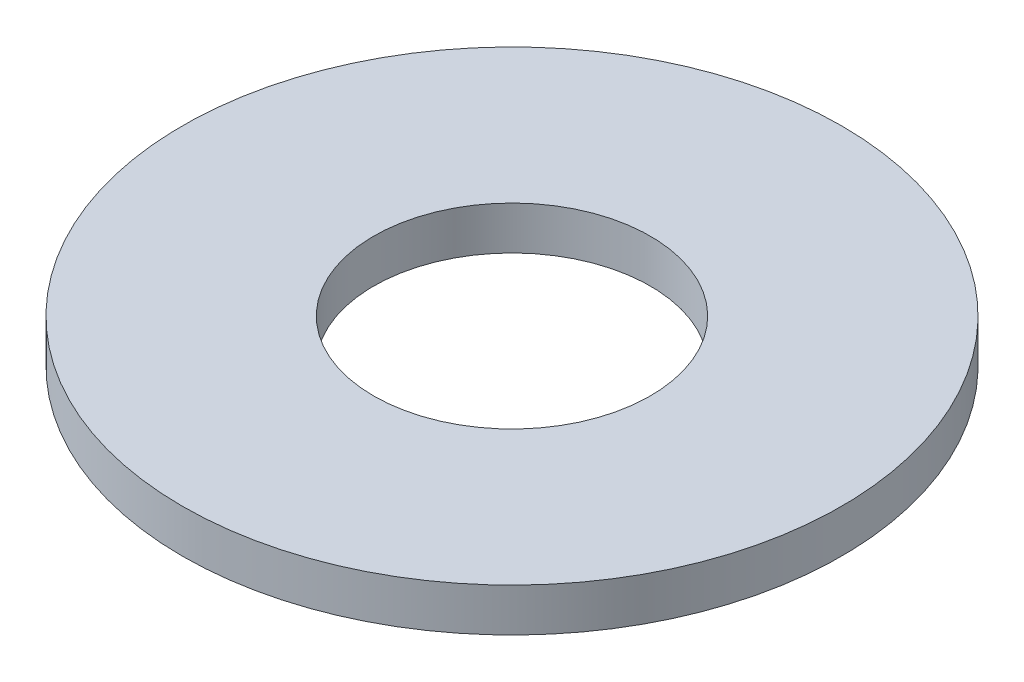
ISO-10303-21;
HEADER;
FILE_DESCRIPTION(('STEP AP214'),'2;1');
FILE_NAME('part.step','',(''),(''),'','','');
FILE_SCHEMA(('AUTOMOTIVE_DESIGN { 1 0 10303 214 1 1 1 1 }'));
ENDSEC;
DATA;
#1=APPLICATION_CONTEXT('core data for automotive mechanical design processes');
#2=APPLICATION_PROTOCOL_DEFINITION('international standard','automotive_design',2000,#1);
#3=PRODUCT_CONTEXT('',#1,'mechanical');
#4=PRODUCT('Part','Part','',(#3));
#5=PRODUCT_RELATED_PRODUCT_CATEGORY('part','',(#4));
#6=PRODUCT_DEFINITION_FORMATION('','',#4);
#7=PRODUCT_DEFINITION_CONTEXT('part definition',#1,'design');
#8=PRODUCT_DEFINITION('design','',#6,#7);
#9=PRODUCT_DEFINITION_SHAPE('','',#8);
#10=(LENGTH_UNIT() NAMED_UNIT(*) SI_UNIT(.MILLI.,.METRE.));
#11=(NAMED_UNIT(*) PLANE_ANGLE_UNIT() SI_UNIT($,.RADIAN.));
#12=(NAMED_UNIT(*) SI_UNIT($,.STERADIAN.) SOLID_ANGLE_UNIT());
#13=UNCERTAINTY_MEASURE_WITH_UNIT(LENGTH_MEASURE(1.E-05),#10,'distance_accuracy_value','');
#14=(GEOMETRIC_REPRESENTATION_CONTEXT(3) GLOBAL_UNCERTAINTY_ASSIGNED_CONTEXT((#13)) GLOBAL_UNIT_ASSIGNED_CONTEXT((#10,
#11,#12)) REPRESENTATION_CONTEXT('',''));
#15=CARTESIAN_POINT('',(0.,0.,0.));
#16=DIRECTION('',(0.,0.,1.));
#17=DIRECTION('',(1.,0.,0.));
#18=AXIS2_PLACEMENT_3D('',#15,#16,#17);
#19=CARTESIAN_POINT('',(0.,5.,0.));
#20=DIRECTION('',(0.,-1.,0.));
#21=DIRECTION('',(0.,0.,-1.));
#22=AXIS2_PLACEMENT_3D('',#19,#20,#21);
#23=CYLINDRICAL_SURFACE('',#22,38.1);
#24=CARTESIAN_POINT('',(0.,5.,0.));
#25=DIRECTION('',(0.,1.,0.));
#26=DIRECTION('',(0.,0.,1.));
#27=AXIS2_PLACEMENT_3D('',#24,#25,#26);
#28=CIRCLE('',#27,38.1);
#29=CARTESIAN_POINT('',(0.,5.,38.1));
#30=VERTEX_POINT('',#29);
#31=EDGE_CURVE('E10',#30,#30,#28,.T.);
#32=ORIENTED_EDGE('',*,*,#31,.F.);
#33=EDGE_LOOP('',(#32));
#34=FACE_BOUND('',#33,.T.);
#35=CARTESIAN_POINT('',(0.,0.,0.));
#36=DIRECTION('',(0.,1.,0.));
#37=DIRECTION('',(0.,0.,1.));
#38=AXIS2_PLACEMENT_3D('',#35,#36,#37);
#39=CIRCLE('',#38,38.1);
#40=CARTESIAN_POINT('',(0.,0.,38.1));
#41=VERTEX_POINT('',#40);
#42=EDGE_CURVE('E32',#41,#41,#39,.T.);
#43=ORIENTED_EDGE('',*,*,#42,.T.);
#44=EDGE_LOOP('',(#43));
#45=FACE_BOUND('',#44,.T.);
#46=ADVANCED_FACE('F29',(#34,#45),#23,.T.);
#47=CARTESIAN_POINT('',(0.,5.,0.));
#48=DIRECTION('',(0.,1.,0.));
#49=DIRECTION('',(0.,0.,1.));
#50=AXIS2_PLACEMENT_3D('',#47,#48,#49);
#51=PLANE('',#50);
#52=CARTESIAN_POINT('',(0.,5.,0.));
#53=DIRECTION('',(0.,1.,0.));
#54=DIRECTION('',(0.,0.,1.));
#55=AXIS2_PLACEMENT_3D('',#52,#53,#54);
#56=CIRCLE('',#55,16.);
#57=CARTESIAN_POINT('',(0.,5.,16.));
#58=VERTEX_POINT('',#57);
#59=EDGE_CURVE('E41',#58,#58,#56,.T.);
#60=ORIENTED_EDGE('',*,*,#59,.F.);
#61=EDGE_LOOP('',(#60));
#62=FACE_BOUND('',#61,.T.);
#63=ORIENTED_EDGE('',*,*,#31,.T.);
#64=EDGE_LOOP('',(#63));
#65=FACE_BOUND('',#64,.T.);
#66=ADVANCED_FACE('F56',(#62,#65),#51,.T.);
#67=CARTESIAN_POINT('',(0.,0.,0.));
#68=DIRECTION('',(0.,1.,0.));
#69=DIRECTION('',(0.,0.,1.));
#70=AXIS2_PLACEMENT_3D('',#67,#68,#69);
#71=PLANE('',#70);
#72=CARTESIAN_POINT('',(0.,0.,0.));
#73=DIRECTION('',(0.,1.,0.));
#74=DIRECTION('',(0.,0.,1.));
#75=AXIS2_PLACEMENT_3D('',#72,#73,#74);
#76=CIRCLE('',#75,16.);
#77=CARTESIAN_POINT('',(0.,0.,16.));
#78=VERTEX_POINT('',#77);
#79=EDGE_CURVE('E39',#78,#78,#76,.T.);
#80=ORIENTED_EDGE('',*,*,#79,.T.);
#81=EDGE_LOOP('',(#80));
#82=FACE_BOUND('',#81,.T.);
#83=ORIENTED_EDGE('',*,*,#42,.F.);
#84=EDGE_LOOP('',(#83));
#85=FACE_BOUND('',#84,.T.);
#86=ADVANCED_FACE('F47',(#82,#85),#71,.F.);
#87=CARTESIAN_POINT('',(0.,0.,0.));
#88=DIRECTION('',(0.,1.,0.));
#89=DIRECTION('',(0.,0.,1.));
#90=AXIS2_PLACEMENT_3D('',#87,#88,#89);
#91=CYLINDRICAL_SURFACE('',#90,16.);
#92=ORIENTED_EDGE('',*,*,#79,.F.);
#93=EDGE_LOOP('',(#92));
#94=FACE_BOUND('',#93,.T.);
#95=ORIENTED_EDGE('',*,*,#59,.T.);
#96=EDGE_LOOP('',(#95));
#97=FACE_BOUND('',#96,.T.);
#98=ADVANCED_FACE('F50',(#94,#97),#91,.F.);
#99=CLOSED_SHELL('',(#46,#66,#86,#98));
#100=MANIFOLD_SOLID_BREP('B2',#99);
#101=ADVANCED_BREP_SHAPE_REPRESENTATION('',(#18,#100),#14);
#102=SHAPE_DEFINITION_REPRESENTATION(#9,#101);
ENDSEC;
END-ISO-10303-21;
